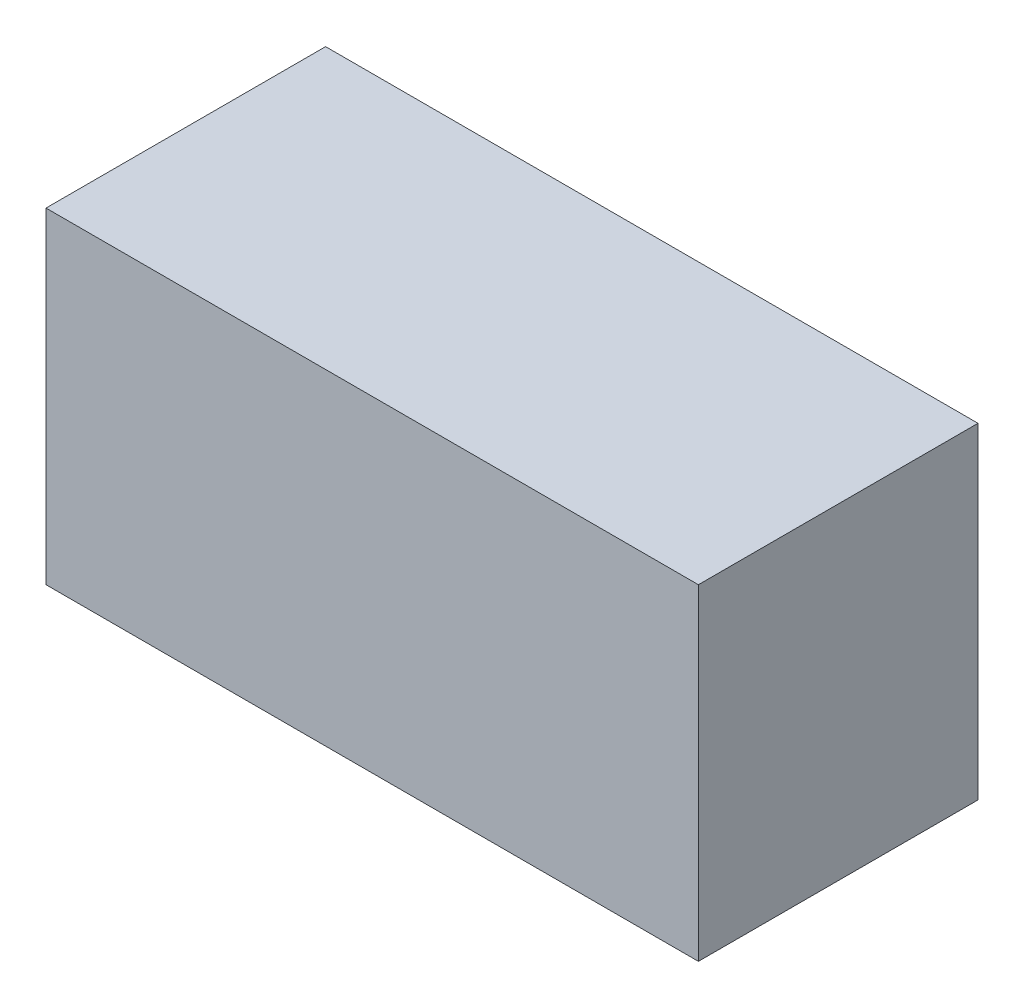
ISO-10303-21;
HEADER;
FILE_DESCRIPTION(('STEP AP214'),'2;1');
FILE_NAME('part.step','',(''),(''),'','','');
FILE_SCHEMA(('AUTOMOTIVE_DESIGN { 1 0 10303 214 1 1 1 1 }'));
ENDSEC;
DATA;
#1=APPLICATION_CONTEXT('core data for automotive mechanical design processes');
#2=APPLICATION_PROTOCOL_DEFINITION('international standard','automotive_design',2000,#1);
#3=PRODUCT_CONTEXT('',#1,'mechanical');
#4=PRODUCT('Part','Part','',(#3));
#5=PRODUCT_RELATED_PRODUCT_CATEGORY('part','',(#4));
#6=PRODUCT_DEFINITION_FORMATION('','',#4);
#7=PRODUCT_DEFINITION_CONTEXT('part definition',#1,'design');
#8=PRODUCT_DEFINITION('design','',#6,#7);
#9=PRODUCT_DEFINITION_SHAPE('','',#8);
#10=(LENGTH_UNIT() NAMED_UNIT(*) SI_UNIT(.MILLI.,.METRE.));
#11=(NAMED_UNIT(*) PLANE_ANGLE_UNIT() SI_UNIT($,.RADIAN.));
#12=(NAMED_UNIT(*) SI_UNIT($,.STERADIAN.) SOLID_ANGLE_UNIT());
#13=UNCERTAINTY_MEASURE_WITH_UNIT(LENGTH_MEASURE(1.E-05),#10,'distance_accuracy_value','');
#14=(GEOMETRIC_REPRESENTATION_CONTEXT(3) GLOBAL_UNCERTAINTY_ASSIGNED_CONTEXT((#13)) GLOBAL_UNIT_ASSIGNED_CONTEXT((#10,
#11,#12)) REPRESENTATION_CONTEXT('',''));
#15=CARTESIAN_POINT('',(0.,0.,0.));
#16=DIRECTION('',(0.,0.,1.));
#17=DIRECTION('',(1.,0.,0.));
#18=AXIS2_PLACEMENT_3D('',#15,#16,#17);
#19=CARTESIAN_POINT('',(5.,65.,55.));
#20=DIRECTION('',(-1.,0.,0.));
#21=DIRECTION('',(0.,0.,1.));
#22=AXIS2_PLACEMENT_3D('',#19,#20,#21);
#23=PLANE('',#22);
#24=DIRECTION('',(0.,0.,-1.));
#25=VECTOR('',#24,1.);
#26=CARTESIAN_POINT('',(5.,5.,55.));
#27=LINE('',#26,#25);
#28=CARTESIAN_POINT('',(5.,5.,55.));
#29=VERTEX_POINT('',#28);
#30=CARTESIAN_POINT('',(5.00000000000001,5.,4.99999999999999));
#31=VERTEX_POINT('',#30);
#32=EDGE_CURVE('E150',#29,#31,#27,.T.);
#33=ORIENTED_EDGE('',*,*,#32,.T.);
#34=DIRECTION('',(0.,-1.,0.));
#35=VECTOR('',#34,1.);
#36=CARTESIAN_POINT('',(5.00000000000001,65.,4.99999999999999));
#37=LINE('',#36,#35);
#38=CARTESIAN_POINT('',(5.00000000000001,65.,4.99999999999999));
#39=VERTEX_POINT('',#38);
#40=EDGE_CURVE('E170',#39,#31,#37,.T.);
#41=ORIENTED_EDGE('',*,*,#40,.F.);
#42=DIRECTION('',(0.,0.,-1.));
#43=VECTOR('',#42,1.);
#44=CARTESIAN_POINT('',(5.,65.,55.));
#45=LINE('',#44,#43);
#46=CARTESIAN_POINT('',(5.,65.,55.));
#47=VERTEX_POINT('',#46);
#48=EDGE_CURVE('E159',#47,#39,#45,.T.);
#49=ORIENTED_EDGE('',*,*,#48,.F.);
#50=DIRECTION('',(0.,-1.,0.));
#51=VECTOR('',#50,1.);
#52=CARTESIAN_POINT('',(5.,65.,55.));
#53=LINE('',#52,#51);
#54=EDGE_CURVE('E173',#47,#29,#53,.T.);
#55=ORIENTED_EDGE('',*,*,#54,.T.);
#56=EDGE_LOOP('',(#33,#41,#49,#55));
#57=FACE_BOUND('',#56,.T.);
#58=ADVANCED_FACE('F36',(#57),#23,.F.);
#59=CARTESIAN_POINT('',(0.,0.,60.));
#60=DIRECTION('',(1.,0.,0.));
#61=DIRECTION('',(0.,1.,0.));
#62=AXIS2_PLACEMENT_3D('',#59,#60,#61);
#63=PLANE('',#62);
#64=DIRECTION('',(0.,-1.,0.));
#65=VECTOR('',#64,1.);
#66=CARTESIAN_POINT('',(0.,0.,0.));
#67=LINE('',#66,#65);
#68=CARTESIAN_POINT('',(0.,70.,0.));
#69=VERTEX_POINT('',#68);
#70=CARTESIAN_POINT('',(0.,0.,0.));
#71=VERTEX_POINT('',#70);
#72=EDGE_CURVE('E176',#69,#71,#67,.T.);
#73=ORIENTED_EDGE('',*,*,#72,.T.);
#74=DIRECTION('',(0.,0.,-1.));
#75=VECTOR('',#74,1.);
#76=CARTESIAN_POINT('',(0.,0.,60.));
#77=LINE('',#76,#75);
#78=CARTESIAN_POINT('',(0.,0.,60.));
#79=VERTEX_POINT('',#78);
#80=EDGE_CURVE('E11',#79,#71,#77,.T.);
#81=ORIENTED_EDGE('',*,*,#80,.F.);
#82=DIRECTION('',(0.,-1.,0.));
#83=VECTOR('',#82,1.);
#84=CARTESIAN_POINT('',(0.,0.,60.));
#85=LINE('',#84,#83);
#86=CARTESIAN_POINT('',(0.,70.,60.));
#87=VERTEX_POINT('',#86);
#88=EDGE_CURVE('E183',#87,#79,#85,.T.);
#89=ORIENTED_EDGE('',*,*,#88,.F.);
#90=DIRECTION('',(0.,0.,-1.));
#91=VECTOR('',#90,1.);
#92=CARTESIAN_POINT('',(0.,70.,60.));
#93=LINE('',#92,#91);
#94=EDGE_CURVE('E193',#87,#69,#93,.T.);
#95=ORIENTED_EDGE('',*,*,#94,.T.);
#96=EDGE_LOOP('',(#73,#81,#89,#95));
#97=FACE_BOUND('',#96,.T.);
#98=ADVANCED_FACE('F38',(#97),#63,.F.);
#99=CARTESIAN_POINT('',(0.,0.,60.));
#100=DIRECTION('',(0.,1.,0.));
#101=DIRECTION('',(0.,0.,1.));
#102=AXIS2_PLACEMENT_3D('',#99,#100,#101);
#103=PLANE('',#102);
#104=DIRECTION('',(-1.,0.,0.));
#105=VECTOR('',#104,1.);
#106=CARTESIAN_POINT('',(5.,0.,55.));
#107=LINE('',#106,#105);
#108=CARTESIAN_POINT('',(100.,0.,55.));
#109=VERTEX_POINT('',#108);
#110=CARTESIAN_POINT('',(40.,0.,55.));
#111=VERTEX_POINT('',#110);
#112=EDGE_CURVE('E134',#109,#111,#107,.T.);
#113=ORIENTED_EDGE('',*,*,#112,.F.);
#114=DIRECTION('',(0.,0.,-1.));
#115=VECTOR('',#114,1.);
#116=CARTESIAN_POINT('',(100.,0.,55.));
#117=LINE('',#116,#115);
#118=CARTESIAN_POINT('',(100.,0.,4.99999999999999));
#119=VERTEX_POINT('',#118);
#120=EDGE_CURVE('E131',#109,#119,#117,.T.);
#121=ORIENTED_EDGE('',*,*,#120,.T.);
#122=DIRECTION('',(1.,0.,0.));
#123=VECTOR('',#122,1.);
#124=CARTESIAN_POINT('',(5.00000000000001,0.,4.99999999999999));
#125=LINE('',#124,#123);
#126=CARTESIAN_POINT('',(40.,0.,4.99999999999999));
#127=VERTEX_POINT('',#126);
#128=EDGE_CURVE('E124',#127,#119,#125,.T.);
#129=ORIENTED_EDGE('',*,*,#128,.F.);
#130=DIRECTION('',(0.,0.,1.));
#131=VECTOR('',#130,1.);
#132=CARTESIAN_POINT('',(40.,0.,55.));
#133=LINE('',#132,#131);
#134=EDGE_CURVE('E129',#127,#111,#133,.T.);
#135=ORIENTED_EDGE('',*,*,#134,.T.);
#136=EDGE_LOOP('',(#113,#121,#129,#135));
#137=FACE_BOUND('',#136,.T.);
#138=DIRECTION('',(1.,0.,0.));
#139=VECTOR('',#138,1.);
#140=CARTESIAN_POINT('',(0.,0.,0.));
#141=LINE('',#140,#139);
#142=CARTESIAN_POINT('',(140.,0.,0.));
#143=VERTEX_POINT('',#142);
#144=EDGE_CURVE('E196',#71,#143,#141,.T.);
#145=ORIENTED_EDGE('',*,*,#144,.T.);
#146=DIRECTION('',(0.,0.,-1.));
#147=VECTOR('',#146,1.);
#148=CARTESIAN_POINT('',(140.,0.,60.));
#149=LINE('',#148,#147);
#150=CARTESIAN_POINT('',(140.,0.,60.));
#151=VERTEX_POINT('',#150);
#152=EDGE_CURVE('E44',#151,#143,#149,.T.);
#153=ORIENTED_EDGE('',*,*,#152,.F.);
#154=DIRECTION('',(1.,0.,0.));
#155=VECTOR('',#154,1.);
#156=CARTESIAN_POINT('',(0.,0.,60.));
#157=LINE('',#156,#155);
#158=EDGE_CURVE('E186',#79,#151,#157,.T.);
#159=ORIENTED_EDGE('',*,*,#158,.F.);
#160=ORIENTED_EDGE('',*,*,#80,.T.);
#161=EDGE_LOOP('',(#145,#153,#159,#160));
#162=FACE_BOUND('',#161,.T.);
#163=ADVANCED_FACE('F126',(#137,#162),#103,.F.);
#164=CARTESIAN_POINT('',(140.,0.,60.));
#165=DIRECTION('',(-1.,0.,0.));
#166=DIRECTION('',(0.,-1.,0.));
#167=AXIS2_PLACEMENT_3D('',#164,#165,#166);
#168=PLANE('',#167);
#169=DIRECTION('',(0.,1.,0.));
#170=VECTOR('',#169,1.);
#171=CARTESIAN_POINT('',(140.,0.,0.));
#172=LINE('',#171,#170);
#173=CARTESIAN_POINT('',(140.,70.,0.));
#174=VERTEX_POINT('',#173);
#175=EDGE_CURVE('E198',#143,#174,#172,.T.);
#176=ORIENTED_EDGE('',*,*,#175,.T.);
#177=DIRECTION('',(0.,0.,-1.));
#178=VECTOR('',#177,1.);
#179=CARTESIAN_POINT('',(140.,70.,60.));
#180=LINE('',#179,#178);
#181=CARTESIAN_POINT('',(140.,70.,60.));
#182=VERTEX_POINT('',#181);
#183=EDGE_CURVE('E203',#182,#174,#180,.T.);
#184=ORIENTED_EDGE('',*,*,#183,.F.);
#185=DIRECTION('',(0.,1.,0.));
#186=VECTOR('',#185,1.);
#187=CARTESIAN_POINT('',(140.,0.,60.));
#188=LINE('',#187,#186);
#189=EDGE_CURVE('E189',#151,#182,#188,.T.);
#190=ORIENTED_EDGE('',*,*,#189,.F.);
#191=ORIENTED_EDGE('',*,*,#152,.T.);
#192=EDGE_LOOP('',(#176,#184,#190,#191));
#193=FACE_BOUND('',#192,.T.);
#194=ADVANCED_FACE('F210',(#193),#168,.F.);
#195=CARTESIAN_POINT('',(0.,70.,60.));
#196=DIRECTION('',(0.,-1.,0.));
#197=DIRECTION('',(0.,0.,-1.));
#198=AXIS2_PLACEMENT_3D('',#195,#196,#197);
#199=PLANE('',#198);
#200=DIRECTION('',(-1.,0.,0.));
#201=VECTOR('',#200,1.);
#202=CARTESIAN_POINT('',(0.,70.,0.));
#203=LINE('',#202,#201);
#204=EDGE_CURVE('E187',#174,#69,#203,.T.);
#205=ORIENTED_EDGE('',*,*,#204,.T.);
#206=ORIENTED_EDGE('',*,*,#94,.F.);
#207=DIRECTION('',(-1.,0.,0.));
#208=VECTOR('',#207,1.);
#209=CARTESIAN_POINT('',(0.,70.,60.));
#210=LINE('',#209,#208);
#211=EDGE_CURVE('E191',#182,#87,#210,.T.);
#212=ORIENTED_EDGE('',*,*,#211,.F.);
#213=ORIENTED_EDGE('',*,*,#183,.T.);
#214=EDGE_LOOP('',(#205,#206,#212,#213));
#215=FACE_BOUND('',#214,.T.);
#216=ADVANCED_FACE('F218',(#215),#199,.F.);
#217=CARTESIAN_POINT('',(0.,0.,60.));
#218=DIRECTION('',(0.,0.,-1.));
#219=DIRECTION('',(-1.,0.,0.));
#220=AXIS2_PLACEMENT_3D('',#217,#218,#219);
#221=PLANE('',#220);
#222=ORIENTED_EDGE('',*,*,#88,.T.);
#223=ORIENTED_EDGE('',*,*,#158,.T.);
#224=ORIENTED_EDGE('',*,*,#189,.T.);
#225=ORIENTED_EDGE('',*,*,#211,.T.);
#226=EDGE_LOOP('',(#222,#223,#224,#225));
#227=FACE_BOUND('',#226,.T.);
#228=ADVANCED_FACE('F224',(#227),#221,.F.);
#229=CARTESIAN_POINT('',(0.,0.,0.));
#230=DIRECTION('',(0.,0.,-1.));
#231=DIRECTION('',(-1.,0.,0.));
#232=AXIS2_PLACEMENT_3D('',#229,#230,#231);
#233=PLANE('',#232);
#234=ORIENTED_EDGE('',*,*,#72,.F.);
#235=ORIENTED_EDGE('',*,*,#204,.F.);
#236=ORIENTED_EDGE('',*,*,#175,.F.);
#237=ORIENTED_EDGE('',*,*,#144,.F.);
#238=EDGE_LOOP('',(#234,#235,#236,#237));
#239=FACE_BOUND('',#238,.T.);
#240=ADVANCED_FACE('F215',(#239),#233,.T.);
#241=CARTESIAN_POINT('',(5.,65.,55.));
#242=DIRECTION('',(0.,0.,1.));
#243=DIRECTION('',(1.,0.,0.));
#244=AXIS2_PLACEMENT_3D('',#241,#242,#243);
#245=PLANE('',#244);
#246=DIRECTION('',(-1.,0.,0.));
#247=VECTOR('',#246,1.);
#248=CARTESIAN_POINT('',(135.,5.,55.));
#249=LINE('',#248,#247);
#250=CARTESIAN_POINT('',(135.,5.,55.));
#251=VERTEX_POINT('',#250);
#252=CARTESIAN_POINT('',(100.,5.,55.));
#253=VERTEX_POINT('',#252);
#254=EDGE_CURVE('E51',#251,#253,#249,.T.);
#255=ORIENTED_EDGE('',*,*,#254,.T.);
#256=DIRECTION('',(0.,-1.,0.));
#257=VECTOR('',#256,1.);
#258=CARTESIAN_POINT('',(100.,5.,55.));
#259=LINE('',#258,#257);
#260=EDGE_CURVE('E55',#253,#109,#259,.T.);
#261=ORIENTED_EDGE('',*,*,#260,.T.);
#262=ORIENTED_EDGE('',*,*,#112,.T.);
#263=DIRECTION('',(0.,-1.,0.));
#264=VECTOR('',#263,1.);
#265=CARTESIAN_POINT('',(40.,5.,55.));
#266=LINE('',#265,#264);
#267=CARTESIAN_POINT('',(40.,5.,55.));
#268=VERTEX_POINT('',#267);
#269=EDGE_CURVE('E135',#268,#111,#266,.T.);
#270=ORIENTED_EDGE('',*,*,#269,.F.);
#271=DIRECTION('',(-1.,0.,0.));
#272=VECTOR('',#271,1.);
#273=CARTESIAN_POINT('',(5.,5.,55.));
#274=LINE('',#273,#272);
#275=EDGE_CURVE('E146',#268,#29,#274,.T.);
#276=ORIENTED_EDGE('',*,*,#275,.T.);
#277=ORIENTED_EDGE('',*,*,#54,.F.);
#278=DIRECTION('',(-1.,0.,0.));
#279=VECTOR('',#278,1.);
#280=CARTESIAN_POINT('',(5.,65.,55.));
#281=LINE('',#280,#279);
#282=CARTESIAN_POINT('',(135.,65.,55.));
#283=VERTEX_POINT('',#282);
#284=EDGE_CURVE('E168',#283,#47,#281,.T.);
#285=ORIENTED_EDGE('',*,*,#284,.F.);
#286=DIRECTION('',(0.,-1.,0.));
#287=VECTOR('',#286,1.);
#288=CARTESIAN_POINT('',(135.,65.,55.));
#289=LINE('',#288,#287);
#290=EDGE_CURVE('E177',#283,#251,#289,.T.);
#291=ORIENTED_EDGE('',*,*,#290,.T.);
#292=EDGE_LOOP('',(#255,#261,#262,#270,#276,#277,#285,#291));
#293=FACE_BOUND('',#292,.T.);
#294=ADVANCED_FACE('F243',(#293),#245,.F.);
#295=CARTESIAN_POINT('',(135.,65.,55.));
#296=DIRECTION('',(1.,0.,0.));
#297=DIRECTION('',(0.,0.,-1.));
#298=AXIS2_PLACEMENT_3D('',#295,#296,#297);
#299=PLANE('',#298);
#300=DIRECTION('',(0.,-1.,0.));
#301=VECTOR('',#300,1.);
#302=CARTESIAN_POINT('',(135.,65.,4.99999999999999));
#303=LINE('',#302,#301);
#304=CARTESIAN_POINT('',(135.,65.,4.99999999999999));
#305=VERTEX_POINT('',#304);
#306=CARTESIAN_POINT('',(135.,5.,4.99999999999999));
#307=VERTEX_POINT('',#306);
#308=EDGE_CURVE('E179',#305,#307,#303,.T.);
#309=ORIENTED_EDGE('',*,*,#308,.T.);
#310=DIRECTION('',(0.,0.,1.));
#311=VECTOR('',#310,1.);
#312=CARTESIAN_POINT('',(135.,5.,55.));
#313=LINE('',#312,#311);
#314=EDGE_CURVE('E363',#307,#251,#313,.T.);
#315=ORIENTED_EDGE('',*,*,#314,.T.);
#316=ORIENTED_EDGE('',*,*,#290,.F.);
#317=DIRECTION('',(0.,0.,1.));
#318=VECTOR('',#317,1.);
#319=CARTESIAN_POINT('',(135.,65.,55.));
#320=LINE('',#319,#318);
#321=EDGE_CURVE('E165',#305,#283,#320,.T.);
#322=ORIENTED_EDGE('',*,*,#321,.F.);
#323=EDGE_LOOP('',(#309,#315,#316,#322));
#324=FACE_BOUND('',#323,.T.);
#325=ADVANCED_FACE('F264',(#324),#299,.F.);
#326=CARTESIAN_POINT('',(5.00000000000001,65.,4.99999999999999));
#327=DIRECTION('',(0.,0.,-1.));
#328=DIRECTION('',(-1.,0.,0.));
#329=AXIS2_PLACEMENT_3D('',#326,#327,#328);
#330=PLANE('',#329);
#331=ORIENTED_EDGE('',*,*,#128,.T.);
#332=DIRECTION('',(0.,-1.,0.));
#333=VECTOR('',#332,1.);
#334=CARTESIAN_POINT('',(100.,5.,4.99999999999999));
#335=LINE('',#334,#333);
#336=CARTESIAN_POINT('',(100.,5.,4.99999999999999));
#337=VERTEX_POINT('',#336);
#338=EDGE_CURVE('E151',#337,#119,#335,.T.);
#339=ORIENTED_EDGE('',*,*,#338,.F.);
#340=DIRECTION('',(1.,0.,0.));
#341=VECTOR('',#340,1.);
#342=CARTESIAN_POINT('',(135.,5.,4.99999999999999));
#343=LINE('',#342,#341);
#344=EDGE_CURVE('E365',#337,#307,#343,.T.);
#345=ORIENTED_EDGE('',*,*,#344,.T.);
#346=ORIENTED_EDGE('',*,*,#308,.F.);
#347=DIRECTION('',(1.,0.,0.));
#348=VECTOR('',#347,1.);
#349=CARTESIAN_POINT('',(5.00000000000001,65.,4.99999999999999));
#350=LINE('',#349,#348);
#351=EDGE_CURVE('E162',#39,#305,#350,.T.);
#352=ORIENTED_EDGE('',*,*,#351,.F.);
#353=ORIENTED_EDGE('',*,*,#40,.T.);
#354=DIRECTION('',(1.,0.,0.));
#355=VECTOR('',#354,1.);
#356=CARTESIAN_POINT('',(5.,5.,4.99999999999999));
#357=LINE('',#356,#355);
#358=CARTESIAN_POINT('',(40.,5.,4.99999999999999));
#359=VERTEX_POINT('',#358);
#360=EDGE_CURVE('E142',#31,#359,#357,.T.);
#361=ORIENTED_EDGE('',*,*,#360,.T.);
#362=DIRECTION('',(0.,-1.,0.));
#363=VECTOR('',#362,1.);
#364=CARTESIAN_POINT('',(40.,5.,4.99999999999999));
#365=LINE('',#364,#363);
#366=EDGE_CURVE('E138',#359,#127,#365,.T.);
#367=ORIENTED_EDGE('',*,*,#366,.T.);
#368=EDGE_LOOP('',(#331,#339,#345,#346,#352,#353,#361,#367));
#369=FACE_BOUND('',#368,.T.);
#370=ADVANCED_FACE('F139',(#369),#330,.F.);
#371=CARTESIAN_POINT('',(0.,65.,0.));
#372=DIRECTION('',(0.,-1.,0.));
#373=DIRECTION('',(0.,0.,-1.));
#374=AXIS2_PLACEMENT_3D('',#371,#372,#373);
#375=PLANE('',#374);
#376=ORIENTED_EDGE('',*,*,#48,.T.);
#377=ORIENTED_EDGE('',*,*,#351,.T.);
#378=ORIENTED_EDGE('',*,*,#321,.T.);
#379=ORIENTED_EDGE('',*,*,#284,.T.);
#380=EDGE_LOOP('',(#376,#377,#378,#379));
#381=FACE_BOUND('',#380,.T.);
#382=ADVANCED_FACE('F277',(#381),#375,.T.);
#383=CARTESIAN_POINT('',(40.,5.,55.));
#384=DIRECTION('',(1.,0.,0.));
#385=DIRECTION('',(0.,0.,-1.));
#386=AXIS2_PLACEMENT_3D('',#383,#384,#385);
#387=PLANE('',#386);
#388=ORIENTED_EDGE('',*,*,#134,.F.);
#389=ORIENTED_EDGE('',*,*,#366,.F.);
#390=DIRECTION('',(0.,0.,1.));
#391=VECTOR('',#390,1.);
#392=CARTESIAN_POINT('',(40.,5.,55.));
#393=LINE('',#392,#391);
#394=EDGE_CURVE('E375',#359,#268,#393,.T.);
#395=ORIENTED_EDGE('',*,*,#394,.T.);
#396=ORIENTED_EDGE('',*,*,#269,.T.);
#397=EDGE_LOOP('',(#388,#389,#395,#396));
#398=FACE_BOUND('',#397,.T.);
#399=ADVANCED_FACE('F149',(#398),#387,.T.);
#400=CARTESIAN_POINT('',(0.,5.,0.));
#401=DIRECTION('',(0.,-1.,0.));
#402=DIRECTION('',(0.,0.,-1.));
#403=AXIS2_PLACEMENT_3D('',#400,#401,#402);
#404=PLANE('',#403);
#405=ORIENTED_EDGE('',*,*,#32,.F.);
#406=ORIENTED_EDGE('',*,*,#275,.F.);
#407=ORIENTED_EDGE('',*,*,#394,.F.);
#408=ORIENTED_EDGE('',*,*,#360,.F.);
#409=EDGE_LOOP('',(#405,#406,#407,#408));
#410=FACE_BOUND('',#409,.T.);
#411=ADVANCED_FACE('F289',(#410),#404,.F.);
#412=CARTESIAN_POINT('',(100.,5.,55.));
#413=DIRECTION('',(-1.,0.,0.));
#414=DIRECTION('',(0.,0.,1.));
#415=AXIS2_PLACEMENT_3D('',#412,#413,#414);
#416=PLANE('',#415);
#417=ORIENTED_EDGE('',*,*,#120,.F.);
#418=ORIENTED_EDGE('',*,*,#260,.F.);
#419=DIRECTION('',(0.,0.,-1.));
#420=VECTOR('',#419,1.);
#421=CARTESIAN_POINT('',(100.,5.,55.));
#422=LINE('',#421,#420);
#423=EDGE_CURVE('E367',#253,#337,#422,.T.);
#424=ORIENTED_EDGE('',*,*,#423,.T.);
#425=ORIENTED_EDGE('',*,*,#338,.T.);
#426=EDGE_LOOP('',(#417,#418,#424,#425));
#427=FACE_BOUND('',#426,.T.);
#428=ADVANCED_FACE('F296',(#427),#416,.T.);
#429=CARTESIAN_POINT('',(0.,5.,0.));
#430=DIRECTION('',(0.,1.,0.));
#431=DIRECTION('',(0.,0.,1.));
#432=AXIS2_PLACEMENT_3D('',#429,#430,#431);
#433=PLANE('',#432);
#434=ORIENTED_EDGE('',*,*,#314,.F.);
#435=ORIENTED_EDGE('',*,*,#344,.F.);
#436=ORIENTED_EDGE('',*,*,#423,.F.);
#437=ORIENTED_EDGE('',*,*,#254,.F.);
#438=EDGE_LOOP('',(#434,#435,#436,#437));
#439=FACE_BOUND('',#438,.T.);
#440=ADVANCED_FACE('F304',(#439),#433,.T.);
#441=CLOSED_SHELL('',(#58,#98,#163,#194,#216,#228,#240,#294,#325,#370,#382,#399,#411,#428,#440));
#442=MANIFOLD_SOLID_BREP('B2',#441);
#443=ADVANCED_BREP_SHAPE_REPRESENTATION('',(#18,#442),#14);
#444=SHAPE_DEFINITION_REPRESENTATION(#9,#443);
ENDSEC;
END-ISO-10303-21;
